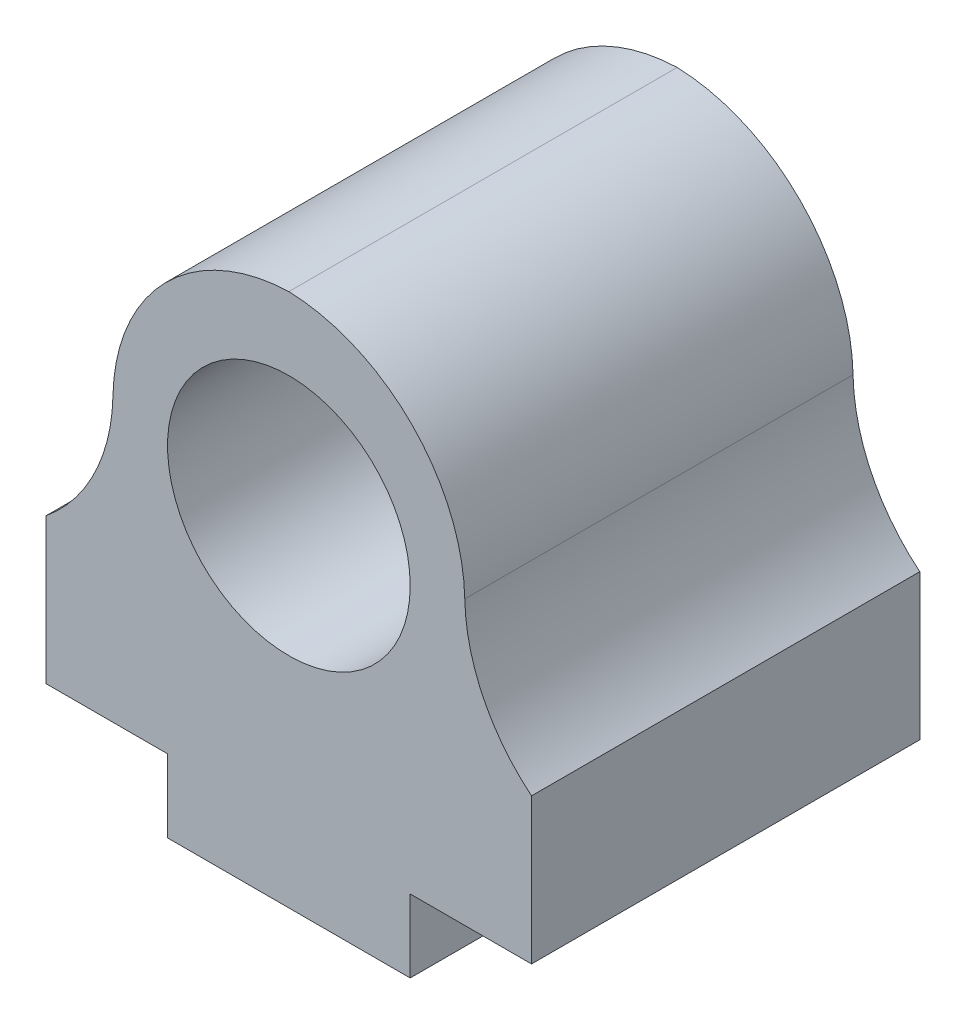
ISO-10303-21;
HEADER;
FILE_DESCRIPTION(('STEP AP214'),'2;1');
FILE_NAME('part.step','',(''),(''),'','','');
FILE_SCHEMA(('AUTOMOTIVE_DESIGN { 1 0 10303 214 1 1 1 1 }'));
ENDSEC;
DATA;
#1=APPLICATION_CONTEXT('core data for automotive mechanical design processes');
#2=APPLICATION_PROTOCOL_DEFINITION('international standard','automotive_design',2000,#1);
#3=PRODUCT_CONTEXT('',#1,'mechanical');
#4=PRODUCT('Part','Part','',(#3));
#5=PRODUCT_RELATED_PRODUCT_CATEGORY('part','',(#4));
#6=PRODUCT_DEFINITION_FORMATION('','',#4);
#7=PRODUCT_DEFINITION_CONTEXT('part definition',#1,'design');
#8=PRODUCT_DEFINITION('design','',#6,#7);
#9=PRODUCT_DEFINITION_SHAPE('','',#8);
#10=(LENGTH_UNIT() NAMED_UNIT(*) SI_UNIT(.MILLI.,.METRE.));
#11=(NAMED_UNIT(*) PLANE_ANGLE_UNIT() SI_UNIT($,.RADIAN.));
#12=(NAMED_UNIT(*) SI_UNIT($,.STERADIAN.) SOLID_ANGLE_UNIT());
#13=UNCERTAINTY_MEASURE_WITH_UNIT(LENGTH_MEASURE(1.E-05),#10,'distance_accuracy_value','');
#14=(GEOMETRIC_REPRESENTATION_CONTEXT(3) GLOBAL_UNCERTAINTY_ASSIGNED_CONTEXT((#13)) GLOBAL_UNIT_ASSIGNED_CONTEXT((#10,
#11,#12)) REPRESENTATION_CONTEXT('',''));
#15=CARTESIAN_POINT('',(0.,0.,0.));
#16=DIRECTION('',(0.,0.,1.));
#17=DIRECTION('',(1.,0.,0.));
#18=AXIS2_PLACEMENT_3D('',#15,#16,#17);
#19=CARTESIAN_POINT('',(0.,0.,0.));
#20=DIRECTION('',(0.,-1.,0.));
#21=DIRECTION('',(0.,0.,-1.));
#22=AXIS2_PLACEMENT_3D('',#19,#20,#21);
#23=PLANE('',#22);
#24=DIRECTION('',(0.,0.,-1.));
#25=VECTOR('',#24,1.);
#26=CARTESIAN_POINT('',(5.,0.,0.));
#27=LINE('',#26,#25);
#28=CARTESIAN_POINT('',(5.,0.,0.));
#29=VERTEX_POINT('',#28);
#30=CARTESIAN_POINT('',(5.,0.,-16.));
#31=VERTEX_POINT('',#30);
#32=EDGE_CURVE('E141',#29,#31,#27,.T.);
#33=ORIENTED_EDGE('',*,*,#32,.F.);
#34=DIRECTION('',(1.,0.,0.));
#35=VECTOR('',#34,1.);
#36=CARTESIAN_POINT('',(0.,0.,0.));
#37=LINE('',#36,#35);
#38=CARTESIAN_POINT('',(0.,0.,0.));
#39=VERTEX_POINT('',#38);
#40=EDGE_CURVE('E158',#39,#29,#37,.T.);
#41=ORIENTED_EDGE('',*,*,#40,.F.);
#42=DIRECTION('',(0.,0.,1.));
#43=VECTOR('',#42,1.);
#44=CARTESIAN_POINT('',(0.,0.,0.));
#45=LINE('',#44,#43);
#46=CARTESIAN_POINT('',(0.,0.,-16.));
#47=VERTEX_POINT('',#46);
#48=EDGE_CURVE('E142',#47,#39,#45,.T.);
#49=ORIENTED_EDGE('',*,*,#48,.F.);
#50=DIRECTION('',(-1.,0.,0.));
#51=VECTOR('',#50,1.);
#52=CARTESIAN_POINT('',(0.,0.,-16.));
#53=LINE('',#52,#51);
#54=EDGE_CURVE('E163',#31,#47,#53,.T.);
#55=ORIENTED_EDGE('',*,*,#54,.F.);
#56=EDGE_LOOP('',(#33,#41,#49,#55));
#57=FACE_BOUND('',#56,.T.);
#58=ADVANCED_FACE('F37',(#57),#23,.T.);
#59=CARTESIAN_POINT('',(0.,6.,0.));
#60=DIRECTION('',(1.,0.,0.));
#61=DIRECTION('',(0.,0.,-1.));
#62=AXIS2_PLACEMENT_3D('',#59,#60,#61);
#63=PLANE('',#62);
#64=ORIENTED_EDGE('',*,*,#48,.T.);
#65=DIRECTION('',(0.,-1.,0.));
#66=VECTOR('',#65,1.);
#67=CARTESIAN_POINT('',(0.,6.,0.));
#68=LINE('',#67,#66);
#69=CARTESIAN_POINT('',(0.,6.,0.));
#70=VERTEX_POINT('',#69);
#71=EDGE_CURVE('E173',#70,#39,#68,.T.);
#72=ORIENTED_EDGE('',*,*,#71,.F.);
#73=DIRECTION('',(0.,0.,1.));
#74=VECTOR('',#73,1.);
#75=CARTESIAN_POINT('',(0.,6.,0.));
#76=LINE('',#75,#74);
#77=CARTESIAN_POINT('',(0.,6.,-16.));
#78=VERTEX_POINT('',#77);
#79=EDGE_CURVE('E151',#78,#70,#76,.T.);
#80=ORIENTED_EDGE('',*,*,#79,.F.);
#81=DIRECTION('',(0.,-1.,0.));
#82=VECTOR('',#81,1.);
#83=CARTESIAN_POINT('',(0.,6.,-16.));
#84=LINE('',#83,#82);
#85=EDGE_CURVE('E156',#78,#47,#84,.T.);
#86=ORIENTED_EDGE('',*,*,#85,.T.);
#87=EDGE_LOOP('',(#64,#72,#80,#86));
#88=FACE_BOUND('',#87,.T.);
#89=ADVANCED_FACE('F204',(#88),#63,.F.);
#90=CARTESIAN_POINT('',(0.,6.,0.));
#91=DIRECTION('',(0.,0.,-1.));
#92=DIRECTION('',(-1.,0.,0.));
#93=AXIS2_PLACEMENT_3D('',#90,#91,#92);
#94=PLANE('',#93);
#95=CARTESIAN_POINT('',(10.,11.,0.));
#96=DIRECTION('',(0.,0.,1.));
#97=DIRECTION('',(1.,0.,0.));
#98=AXIS2_PLACEMENT_3D('',#95,#96,#97);
#99=CIRCLE('',#98,5.);
#100=CARTESIAN_POINT('',(15.,11.,0.));
#101=VERTEX_POINT('',#100);
#102=EDGE_CURVE('E190',#101,#101,#99,.T.);
#103=ORIENTED_EDGE('',*,*,#102,.F.);
#104=EDGE_LOOP('',(#103));
#105=FACE_BOUND('',#104,.T.);
#106=DIRECTION('',(0.,-1.,0.));
#107=VECTOR('',#106,1.);
#108=CARTESIAN_POINT('',(20.,6.,0.));
#109=LINE('',#108,#107);
#110=CARTESIAN_POINT('',(20.,6.,0.));
#111=VERTEX_POINT('',#110);
#112=CARTESIAN_POINT('',(20.,0.,0.));
#113=VERTEX_POINT('',#112);
#114=EDGE_CURVE('E170',#111,#113,#109,.T.);
#115=ORIENTED_EDGE('',*,*,#114,.F.);
#116=CARTESIAN_POINT('',(24.7468650433401,11.8066575807702,0.));
#117=DIRECTION('',(0.,0.,-1.));
#118=DIRECTION('',(-1.,0.,0.));
#119=AXIS2_PLACEMENT_3D('',#116,#117,#118);
#120=CIRCLE('',#119,7.5);
#121=CARTESIAN_POINT('',(17.2484325216701,11.6533287903851,0.));
#122=VERTEX_POINT('',#121);
#123=EDGE_CURVE('E197',#111,#122,#120,.T.);
#124=ORIENTED_EDGE('',*,*,#123,.T.);
#125=CARTESIAN_POINT('',(9.75000000000001,11.5,0.));
#126=DIRECTION('',(0.,0.,-1.));
#127=DIRECTION('',(-1.,0.,0.));
#128=AXIS2_PLACEMENT_3D('',#125,#126,#127);
#129=CIRCLE('',#128,7.5);
#130=CARTESIAN_POINT('',(10.,18.9958321752825,0.));
#131=VERTEX_POINT('',#130);
#132=EDGE_CURVE('E184',#122,#131,#129,.F.);
#133=ORIENTED_EDGE('',*,*,#132,.T.);
#134=CARTESIAN_POINT('',(10.25,11.5,0.));
#135=DIRECTION('',(0.,0.,-1.));
#136=DIRECTION('',(-1.,0.,0.));
#137=AXIS2_PLACEMENT_3D('',#134,#135,#136);
#138=CIRCLE('',#137,7.5);
#139=CARTESIAN_POINT('',(2.75156747832995,11.6533287903851,0.));
#140=VERTEX_POINT('',#139);
#141=EDGE_CURVE('E181',#131,#140,#138,.F.);
#142=ORIENTED_EDGE('',*,*,#141,.T.);
#143=CARTESIAN_POINT('',(-4.74686504334009,11.8066575807702,0.));
#144=DIRECTION('',(0.,0.,-1.));
#145=DIRECTION('',(-1.,0.,0.));
#146=AXIS2_PLACEMENT_3D('',#143,#144,#145);
#147=CIRCLE('',#146,7.5);
#148=EDGE_CURVE('E45',#140,#70,#147,.T.);
#149=ORIENTED_EDGE('',*,*,#148,.T.);
#150=ORIENTED_EDGE('',*,*,#71,.T.);
#151=ORIENTED_EDGE('',*,*,#40,.T.);
#152=DIRECTION('',(0.,1.,0.));
#153=VECTOR('',#152,1.);
#154=CARTESIAN_POINT('',(5.,-3.,0.));
#155=LINE('',#154,#153);
#156=CARTESIAN_POINT('',(5.,-3.,0.));
#157=VERTEX_POINT('',#156);
#158=EDGE_CURVE('E234',#157,#29,#155,.T.);
#159=ORIENTED_EDGE('',*,*,#158,.F.);
#160=DIRECTION('',(-1.,0.,0.));
#161=VECTOR('',#160,1.);
#162=CARTESIAN_POINT('',(5.,-3.,0.));
#163=LINE('',#162,#161);
#164=CARTESIAN_POINT('',(15.,-3.,0.));
#165=VERTEX_POINT('',#164);
#166=EDGE_CURVE('E134',#165,#157,#163,.T.);
#167=ORIENTED_EDGE('',*,*,#166,.F.);
#168=DIRECTION('',(0.,1.,0.));
#169=VECTOR('',#168,1.);
#170=CARTESIAN_POINT('',(15.,-3.,0.));
#171=LINE('',#170,#169);
#172=CARTESIAN_POINT('',(15.,0.,0.));
#173=VERTEX_POINT('',#172);
#174=EDGE_CURVE('E147',#165,#173,#171,.T.);
#175=ORIENTED_EDGE('',*,*,#174,.T.);
#176=EDGE_CURVE('E145',#173,#113,#37,.T.);
#177=ORIENTED_EDGE('',*,*,#176,.T.);
#178=EDGE_LOOP('',(#115,#124,#133,#142,#149,#150,#151,#159,#167,#175,#177));
#179=FACE_BOUND('',#178,.T.);
#180=ADVANCED_FACE('F200',(#105,#179),#94,.F.);
#181=CARTESIAN_POINT('',(20.,6.,0.));
#182=DIRECTION('',(-1.,0.,0.));
#183=DIRECTION('',(0.,0.,1.));
#184=AXIS2_PLACEMENT_3D('',#181,#182,#183);
#185=PLANE('',#184);
#186=DIRECTION('',(0.,0.,-1.));
#187=VECTOR('',#186,1.);
#188=CARTESIAN_POINT('',(20.,0.,0.));
#189=LINE('',#188,#187);
#190=CARTESIAN_POINT('',(20.,0.,-16.));
#191=VERTEX_POINT('',#190);
#192=EDGE_CURVE('E161',#113,#191,#189,.T.);
#193=ORIENTED_EDGE('',*,*,#192,.T.);
#194=DIRECTION('',(0.,-1.,0.));
#195=VECTOR('',#194,1.);
#196=CARTESIAN_POINT('',(20.,6.,-16.));
#197=LINE('',#196,#195);
#198=CARTESIAN_POINT('',(20.,6.,-16.));
#199=VERTEX_POINT('',#198);
#200=EDGE_CURVE('E167',#199,#191,#197,.T.);
#201=ORIENTED_EDGE('',*,*,#200,.F.);
#202=DIRECTION('',(0.,0.,-1.));
#203=VECTOR('',#202,1.);
#204=CARTESIAN_POINT('',(20.,6.,0.));
#205=LINE('',#204,#203);
#206=EDGE_CURVE('E153',#111,#199,#205,.T.);
#207=ORIENTED_EDGE('',*,*,#206,.F.);
#208=ORIENTED_EDGE('',*,*,#114,.T.);
#209=EDGE_LOOP('',(#193,#201,#207,#208));
#210=FACE_BOUND('',#209,.T.);
#211=ADVANCED_FACE('F220',(#210),#185,.F.);
#212=CARTESIAN_POINT('',(0.,6.,-16.));
#213=DIRECTION('',(0.,0.,1.));
#214=DIRECTION('',(1.,0.,0.));
#215=AXIS2_PLACEMENT_3D('',#212,#213,#214);
#216=PLANE('',#215);
#217=CARTESIAN_POINT('',(10.,11.,-16.));
#218=DIRECTION('',(0.,0.,1.));
#219=DIRECTION('',(1.,0.,0.));
#220=AXIS2_PLACEMENT_3D('',#217,#218,#219);
#221=CIRCLE('',#220,5.);
#222=CARTESIAN_POINT('',(15.,11.,-16.));
#223=VERTEX_POINT('',#222);
#224=EDGE_CURVE('E230',#223,#223,#221,.T.);
#225=ORIENTED_EDGE('',*,*,#224,.T.);
#226=EDGE_LOOP('',(#225));
#227=FACE_BOUND('',#226,.T.);
#228=ORIENTED_EDGE('',*,*,#85,.F.);
#229=CARTESIAN_POINT('',(-4.7468650433401,11.8066575807702,-16.));
#230=DIRECTION('',(0.,0.,1.));
#231=DIRECTION('',(1.,0.,0.));
#232=AXIS2_PLACEMENT_3D('',#229,#230,#231);
#233=CIRCLE('',#232,7.5);
#234=CARTESIAN_POINT('',(2.75156747832995,11.6533287903851,-16.));
#235=VERTEX_POINT('',#234);
#236=EDGE_CURVE('E11',#78,#235,#233,.T.);
#237=ORIENTED_EDGE('',*,*,#236,.T.);
#238=CARTESIAN_POINT('',(10.25,11.5,-16.));
#239=DIRECTION('',(0.,0.,1.));
#240=DIRECTION('',(1.,0.,0.));
#241=AXIS2_PLACEMENT_3D('',#238,#239,#240);
#242=CIRCLE('',#241,7.5);
#243=CARTESIAN_POINT('',(10.,18.9958321752825,-16.));
#244=VERTEX_POINT('',#243);
#245=EDGE_CURVE('E176',#235,#244,#242,.F.);
#246=ORIENTED_EDGE('',*,*,#245,.T.);
#247=CARTESIAN_POINT('',(9.75,11.5,-16.));
#248=DIRECTION('',(0.,0.,1.));
#249=DIRECTION('',(1.,0.,0.));
#250=AXIS2_PLACEMENT_3D('',#247,#248,#249);
#251=CIRCLE('',#250,7.5);
#252=CARTESIAN_POINT('',(17.24843252167,11.6533287903851,-16.));
#253=VERTEX_POINT('',#252);
#254=EDGE_CURVE('E178',#244,#253,#251,.F.);
#255=ORIENTED_EDGE('',*,*,#254,.T.);
#256=CARTESIAN_POINT('',(24.7468650433401,11.8066575807702,-16.));
#257=DIRECTION('',(0.,0.,1.));
#258=DIRECTION('',(1.,0.,0.));
#259=AXIS2_PLACEMENT_3D('',#256,#257,#258);
#260=CIRCLE('',#259,7.5);
#261=EDGE_CURVE('E195',#253,#199,#260,.T.);
#262=ORIENTED_EDGE('',*,*,#261,.T.);
#263=ORIENTED_EDGE('',*,*,#200,.T.);
#264=CARTESIAN_POINT('',(15.,0.,-16.));
#265=VERTEX_POINT('',#264);
#266=EDGE_CURVE('E154',#191,#265,#53,.T.);
#267=ORIENTED_EDGE('',*,*,#266,.T.);
#268=DIRECTION('',(0.,1.,0.));
#269=VECTOR('',#268,1.);
#270=CARTESIAN_POINT('',(15.,-3.,-16.));
#271=LINE('',#270,#269);
#272=CARTESIAN_POINT('',(15.,-3.,-16.));
#273=VERTEX_POINT('',#272);
#274=EDGE_CURVE('E125',#273,#265,#271,.T.);
#275=ORIENTED_EDGE('',*,*,#274,.F.);
#276=DIRECTION('',(1.,0.,0.));
#277=VECTOR('',#276,1.);
#278=CARTESIAN_POINT('',(5.,-3.,-16.));
#279=LINE('',#278,#277);
#280=CARTESIAN_POINT('',(5.,-3.,-16.));
#281=VERTEX_POINT('',#280);
#282=EDGE_CURVE('E117',#281,#273,#279,.T.);
#283=ORIENTED_EDGE('',*,*,#282,.F.);
#284=DIRECTION('',(0.,1.,0.));
#285=VECTOR('',#284,1.);
#286=CARTESIAN_POINT('',(5.,-3.,-16.));
#287=LINE('',#286,#285);
#288=EDGE_CURVE('E121',#281,#31,#287,.T.);
#289=ORIENTED_EDGE('',*,*,#288,.T.);
#290=ORIENTED_EDGE('',*,*,#54,.T.);
#291=EDGE_LOOP('',(#228,#237,#246,#255,#262,#263,#267,#275,#283,#289,#290));
#292=FACE_BOUND('',#291,.T.);
#293=ADVANCED_FACE('F119',(#227,#292),#216,.F.);
#294=DIRECTION('',(0.,0.,1.));
#295=VECTOR('',#294,1.);
#296=CARTESIAN_POINT('',(15.,0.,0.));
#297=LINE('',#296,#295);
#298=EDGE_CURVE('E138',#265,#173,#297,.T.);
#299=ORIENTED_EDGE('',*,*,#298,.F.);
#300=ORIENTED_EDGE('',*,*,#266,.F.);
#301=ORIENTED_EDGE('',*,*,#192,.F.);
#302=ORIENTED_EDGE('',*,*,#176,.F.);
#303=EDGE_LOOP('',(#299,#300,#301,#302));
#304=FACE_BOUND('',#303,.T.);
#305=ADVANCED_FACE('F224',(#304),#23,.T.);
#306=CARTESIAN_POINT('',(5.,-3.,0.));
#307=DIRECTION('',(1.,0.,0.));
#308=DIRECTION('',(0.,0.,-1.));
#309=AXIS2_PLACEMENT_3D('',#306,#307,#308);
#310=PLANE('',#309);
#311=ORIENTED_EDGE('',*,*,#32,.T.);
#312=ORIENTED_EDGE('',*,*,#288,.F.);
#313=DIRECTION('',(0.,0.,-1.));
#314=VECTOR('',#313,1.);
#315=CARTESIAN_POINT('',(5.,-3.,0.));
#316=LINE('',#315,#314);
#317=EDGE_CURVE('E129',#157,#281,#316,.T.);
#318=ORIENTED_EDGE('',*,*,#317,.F.);
#319=ORIENTED_EDGE('',*,*,#158,.T.);
#320=EDGE_LOOP('',(#311,#312,#318,#319));
#321=FACE_BOUND('',#320,.T.);
#322=ADVANCED_FACE('F140',(#321),#310,.F.);
#323=CARTESIAN_POINT('',(15.,-3.,0.));
#324=DIRECTION('',(-1.,0.,0.));
#325=DIRECTION('',(0.,0.,1.));
#326=AXIS2_PLACEMENT_3D('',#323,#324,#325);
#327=PLANE('',#326);
#328=ORIENTED_EDGE('',*,*,#298,.T.);
#329=ORIENTED_EDGE('',*,*,#174,.F.);
#330=DIRECTION('',(0.,0.,1.));
#331=VECTOR('',#330,1.);
#332=CARTESIAN_POINT('',(15.,-3.,0.));
#333=LINE('',#332,#331);
#334=EDGE_CURVE('E128',#273,#165,#333,.T.);
#335=ORIENTED_EDGE('',*,*,#334,.F.);
#336=ORIENTED_EDGE('',*,*,#274,.T.);
#337=EDGE_LOOP('',(#328,#329,#335,#336));
#338=FACE_BOUND('',#337,.T.);
#339=ADVANCED_FACE('F235',(#338),#327,.F.);
#340=CARTESIAN_POINT('',(0.,-3.,0.));
#341=DIRECTION('',(0.,-1.,0.));
#342=DIRECTION('',(0.,0.,-1.));
#343=AXIS2_PLACEMENT_3D('',#340,#341,#342);
#344=PLANE('',#343);
#345=ORIENTED_EDGE('',*,*,#317,.T.);
#346=ORIENTED_EDGE('',*,*,#282,.T.);
#347=ORIENTED_EDGE('',*,*,#334,.T.);
#348=ORIENTED_EDGE('',*,*,#166,.T.);
#349=EDGE_LOOP('',(#345,#346,#347,#348));
#350=FACE_BOUND('',#349,.T.);
#351=ADVANCED_FACE('F132',(#350),#344,.T.);
#352=CARTESIAN_POINT('',(10.,11.,-16.));
#353=DIRECTION('',(0.,0.,1.));
#354=DIRECTION('',(1.,0.,0.));
#355=AXIS2_PLACEMENT_3D('',#352,#353,#354);
#356=CYLINDRICAL_SURFACE('',#355,5.);
#357=ORIENTED_EDGE('',*,*,#224,.F.);
#358=EDGE_LOOP('',(#357));
#359=FACE_BOUND('',#358,.T.);
#360=ORIENTED_EDGE('',*,*,#102,.T.);
#361=EDGE_LOOP('',(#360));
#362=FACE_BOUND('',#361,.T.);
#363=ADVANCED_FACE('F244',(#359,#362),#356,.F.);
#364=CARTESIAN_POINT('',(10.25,11.5,0.));
#365=DIRECTION('',(0.,0.,-1.));
#366=DIRECTION('',(-1.,0.,0.));
#367=AXIS2_PLACEMENT_3D('',#364,#365,#366);
#368=CYLINDRICAL_SURFACE('',#367,7.5);
#369=ORIENTED_EDGE('',*,*,#245,.F.);
#370=DIRECTION('',(0.,0.,-1.));
#371=VECTOR('',#370,1.);
#372=CARTESIAN_POINT('',(2.75156747832995,11.6533287903851,0.));
#373=LINE('',#372,#371);
#374=EDGE_CURVE('E193',#235,#140,#373,.F.);
#375=ORIENTED_EDGE('',*,*,#374,.T.);
#376=ORIENTED_EDGE('',*,*,#141,.F.);
#377=DIRECTION('',(0.,0.,-1.));
#378=VECTOR('',#377,1.);
#379=CARTESIAN_POINT('',(10.,18.9958321752825,-8.));
#380=LINE('',#379,#378);
#381=EDGE_CURVE('E187',#244,#131,#380,.F.);
#382=ORIENTED_EDGE('',*,*,#381,.F.);
#383=EDGE_LOOP('',(#369,#375,#376,#382));
#384=FACE_BOUND('',#383,.T.);
#385=ADVANCED_FACE('F207',(#384),#368,.T.);
#386=CARTESIAN_POINT('',(9.75000000000001,11.5,0.));
#387=DIRECTION('',(0.,0.,1.));
#388=DIRECTION('',(1.,0.,0.));
#389=AXIS2_PLACEMENT_3D('',#386,#387,#388);
#390=CYLINDRICAL_SURFACE('',#389,7.5);
#391=ORIENTED_EDGE('',*,*,#132,.F.);
#392=DIRECTION('',(0.,0.,1.));
#393=VECTOR('',#392,1.);
#394=CARTESIAN_POINT('',(17.2484325216701,11.6533287903851,0.));
#395=LINE('',#394,#393);
#396=EDGE_CURVE('E186',#122,#253,#395,.F.);
#397=ORIENTED_EDGE('',*,*,#396,.T.);
#398=ORIENTED_EDGE('',*,*,#254,.F.);
#399=ORIENTED_EDGE('',*,*,#381,.T.);
#400=EDGE_LOOP('',(#391,#397,#398,#399));
#401=FACE_BOUND('',#400,.T.);
#402=ADVANCED_FACE('F213',(#401),#390,.T.);
#403=CARTESIAN_POINT('',(24.7468650433401,11.8066575807702,0.));
#404=DIRECTION('',(0.,0.,1.));
#405=DIRECTION('',(1.,0.,0.));
#406=AXIS2_PLACEMENT_3D('',#403,#404,#405);
#407=CYLINDRICAL_SURFACE('',#406,7.5);
#408=ORIENTED_EDGE('',*,*,#123,.F.);
#409=ORIENTED_EDGE('',*,*,#206,.T.);
#410=ORIENTED_EDGE('',*,*,#261,.F.);
#411=ORIENTED_EDGE('',*,*,#396,.F.);
#412=EDGE_LOOP('',(#408,#409,#410,#411));
#413=FACE_BOUND('',#412,.T.);
#414=ADVANCED_FACE('F217',(#413),#407,.F.);
#415=CARTESIAN_POINT('',(-4.74686504334009,11.8066575807702,0.));
#416=DIRECTION('',(0.,0.,-1.));
#417=DIRECTION('',(-1.,0.,0.));
#418=AXIS2_PLACEMENT_3D('',#415,#416,#417);
#419=CYLINDRICAL_SURFACE('',#418,7.5);
#420=ORIENTED_EDGE('',*,*,#236,.F.);
#421=ORIENTED_EDGE('',*,*,#79,.T.);
#422=ORIENTED_EDGE('',*,*,#148,.F.);
#423=ORIENTED_EDGE('',*,*,#374,.F.);
#424=EDGE_LOOP('',(#420,#421,#422,#423));
#425=FACE_BOUND('',#424,.T.);
#426=ADVANCED_FACE('F39',(#425),#419,.F.);
#427=CLOSED_SHELL('',(#58,#89,#180,#211,#293,#305,#322,#339,#351,#363,#385,#402,#414,#426));
#428=MANIFOLD_SOLID_BREP('B2',#427);
#429=ADVANCED_BREP_SHAPE_REPRESENTATION('',(#18,#428),#14);
#430=SHAPE_DEFINITION_REPRESENTATION(#9,#429);
ENDSEC;
END-ISO-10303-21;
